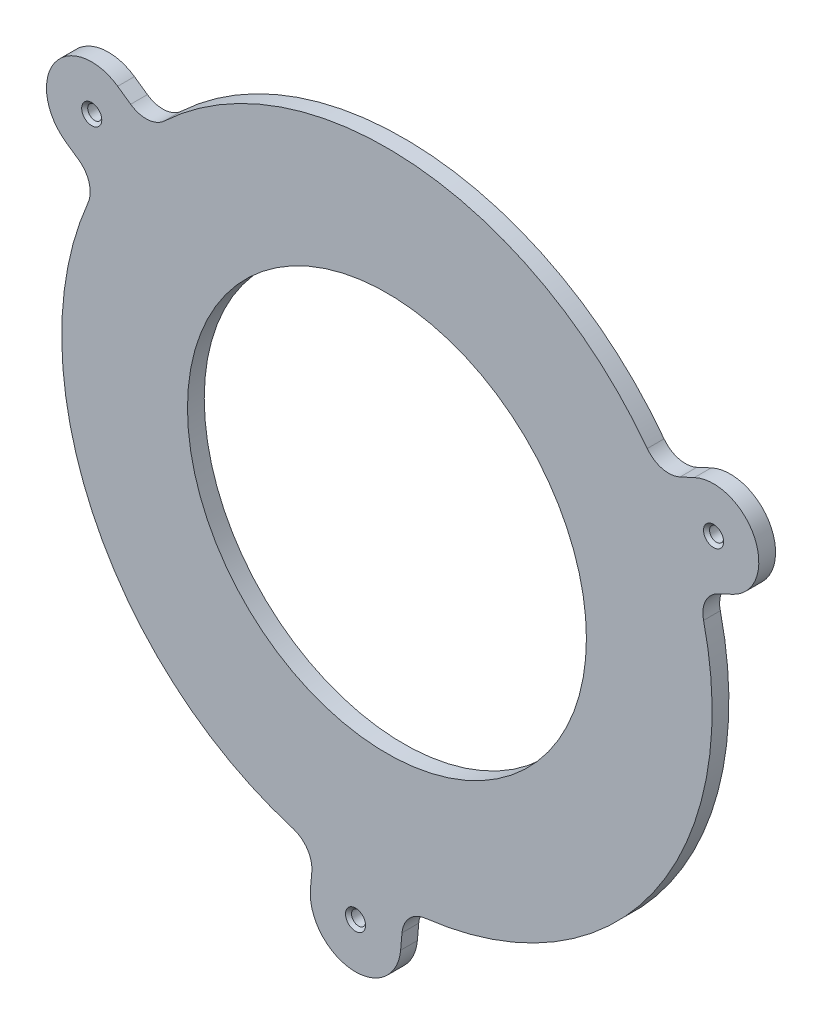
ISO-10303-21;
HEADER;
FILE_DESCRIPTION(('STEP AP214'),'2;1');
FILE_NAME('part.step','',(''),(''),'','','');
FILE_SCHEMA(('AUTOMOTIVE_DESIGN { 1 0 10303 214 1 1 1 1 }'));
ENDSEC;
DATA;
#1=APPLICATION_CONTEXT('core data for automotive mechanical design processes');
#2=APPLICATION_PROTOCOL_DEFINITION('international standard','automotive_design',2000,#1);
#3=PRODUCT_CONTEXT('',#1,'mechanical');
#4=PRODUCT('Part','Part','',(#3));
#5=PRODUCT_RELATED_PRODUCT_CATEGORY('part','',(#4));
#6=PRODUCT_DEFINITION_FORMATION('','',#4);
#7=PRODUCT_DEFINITION_CONTEXT('part definition',#1,'design');
#8=PRODUCT_DEFINITION('design','',#6,#7);
#9=PRODUCT_DEFINITION_SHAPE('','',#8);
#10=(LENGTH_UNIT() NAMED_UNIT(*) SI_UNIT(.MILLI.,.METRE.));
#11=(NAMED_UNIT(*) PLANE_ANGLE_UNIT() SI_UNIT($,.RADIAN.));
#12=(NAMED_UNIT(*) SI_UNIT($,.STERADIAN.) SOLID_ANGLE_UNIT());
#13=UNCERTAINTY_MEASURE_WITH_UNIT(LENGTH_MEASURE(1.E-05),#10,'distance_accuracy_value','');
#14=(GEOMETRIC_REPRESENTATION_CONTEXT(3) GLOBAL_UNCERTAINTY_ASSIGNED_CONTEXT((#13)) GLOBAL_UNIT_ASSIGNED_CONTEXT((#10,
#11,#12)) REPRESENTATION_CONTEXT('',''));
#15=CARTESIAN_POINT('',(0.,0.,0.));
#16=DIRECTION('',(0.,0.,1.));
#17=DIRECTION('',(1.,0.,0.));
#18=AXIS2_PLACEMENT_3D('',#15,#16,#17);
#19=CARTESIAN_POINT('',(0.,0.,5.));
#20=DIRECTION('',(0.,0.,-1.));
#21=DIRECTION('',(-1.,0.,0.));
#22=AXIS2_PLACEMENT_3D('',#19,#20,#21);
#23=CYLINDRICAL_SURFACE('',#22,97.);
#24=CARTESIAN_POINT('',(0.,0.,0.));
#25=DIRECTION('',(0.,0.,1.));
#26=DIRECTION('',(1.,0.,0.));
#27=AXIS2_PLACEMENT_3D('',#24,#25,#26);
#28=CIRCLE('',#27,97.);
#29=CARTESIAN_POINT('',(-89.1665031008976,38.1881490093146,0.));
#30=VERTEX_POINT('',#29);
#31=CARTESIAN_POINT('',(-28.0613040507495,-92.8523732328441,0.));
#32=VERTEX_POINT('',#31);
#33=EDGE_CURVE('E261',#30,#32,#28,.T.);
#34=ORIENTED_EDGE('',*,*,#33,.T.);
#35=DIRECTION('',(0.,0.,-1.));
#36=VECTOR('',#35,1.);
#37=CARTESIAN_POINT('',(-28.0613040507495,-92.8523732328441,5.));
#38=LINE('',#37,#36);
#39=CARTESIAN_POINT('',(-28.0613040507495,-92.8523732328441,5.));
#40=VERTEX_POINT('',#39);
#41=EDGE_CURVE('E307',#32,#40,#38,.F.);
#42=ORIENTED_EDGE('',*,*,#41,.T.);
#43=CARTESIAN_POINT('',(0.,0.,5.));
#44=DIRECTION('',(0.,0.,1.));
#45=DIRECTION('',(1.,0.,0.));
#46=AXIS2_PLACEMENT_3D('',#43,#44,#45);
#47=CIRCLE('',#46,97.);
#48=CARTESIAN_POINT('',(-89.1665031008976,38.1881490093146,5.));
#49=VERTEX_POINT('',#48);
#50=EDGE_CURVE('E256',#49,#40,#47,.T.);
#51=ORIENTED_EDGE('',*,*,#50,.F.);
#52=DIRECTION('',(0.,0.,-1.));
#53=VECTOR('',#52,1.);
#54=CARTESIAN_POINT('',(-89.1665031008976,38.1881490093146,5.));
#55=LINE('',#54,#53);
#56=EDGE_CURVE('E270',#49,#30,#55,.T.);
#57=ORIENTED_EDGE('',*,*,#56,.T.);
#58=EDGE_LOOP('',(#34,#42,#51,#57));
#59=FACE_BOUND('',#58,.T.);
#60=ADVANCED_FACE('F46',(#59),#23,.T.);
#61=CARTESIAN_POINT('',(11.5113443848759,-96.3145313566587,5.));
#62=VERTEX_POINT('',#61);
#63=CARTESIAN_POINT('',(94.4431660466919,22.1243844451543,5.));
#64=VERTEX_POINT('',#63);
#65=EDGE_CURVE('E259',#62,#64,#47,.T.);
#66=ORIENTED_EDGE('',*,*,#65,.F.);
#67=DIRECTION('',(0.,0.,-1.));
#68=VECTOR('',#67,1.);
#69=CARTESIAN_POINT('',(11.5113443848759,-96.3145313566587,5.));
#70=LINE('',#69,#68);
#71=CARTESIAN_POINT('',(11.5113443848759,-96.3145313566587,0.));
#72=VERTEX_POINT('',#71);
#73=EDGE_CURVE('E305',#62,#72,#70,.T.);
#74=ORIENTED_EDGE('',*,*,#73,.T.);
#75=CARTESIAN_POINT('',(94.4431660466919,22.1243844451543,0.));
#76=VERTEX_POINT('',#75);
#77=EDGE_CURVE('E264',#72,#76,#28,.T.);
#78=ORIENTED_EDGE('',*,*,#77,.T.);
#79=DIRECTION('',(0.,0.,-1.));
#80=VECTOR('',#79,1.);
#81=CARTESIAN_POINT('',(94.4431660466919,22.1243844451543,5.));
#82=LINE('',#81,#80);
#83=EDGE_CURVE('E288',#76,#64,#82,.F.);
#84=ORIENTED_EDGE('',*,*,#83,.T.);
#85=EDGE_LOOP('',(#66,#74,#78,#84));
#86=FACE_BOUND('',#85,.T.);
#87=ADVANCED_FACE('F331',(#86),#23,.T.);
#88=CARTESIAN_POINT('',(77.6551587160211,58.1263823473436,5.));
#89=VERTEX_POINT('',#88);
#90=CARTESIAN_POINT('',(-66.3818619959432,70.7279887876897,5.));
#91=VERTEX_POINT('',#90);
#92=EDGE_CURVE('E260',#89,#91,#47,.T.);
#93=ORIENTED_EDGE('',*,*,#92,.F.);
#94=DIRECTION('',(0.,0.,-1.));
#95=VECTOR('',#94,1.);
#96=CARTESIAN_POINT('',(77.6551587160211,58.1263823473436,5.));
#97=LINE('',#96,#95);
#98=CARTESIAN_POINT('',(77.6551587160211,58.1263823473436,0.));
#99=VERTEX_POINT('',#98);
#100=EDGE_CURVE('E286',#89,#99,#97,.T.);
#101=ORIENTED_EDGE('',*,*,#100,.T.);
#102=CARTESIAN_POINT('',(-66.3818619959432,70.7279887876897,0.));
#103=VERTEX_POINT('',#102);
#104=EDGE_CURVE('E253',#99,#103,#28,.T.);
#105=ORIENTED_EDGE('',*,*,#104,.T.);
#106=DIRECTION('',(0.,0.,-1.));
#107=VECTOR('',#106,1.);
#108=CARTESIAN_POINT('',(-66.3818619959432,70.7279887876897,5.));
#109=LINE('',#108,#107);
#110=EDGE_CURVE('E267',#103,#91,#109,.F.);
#111=ORIENTED_EDGE('',*,*,#110,.T.);
#112=EDGE_LOOP('',(#93,#101,#105,#111));
#113=FACE_BOUND('',#112,.T.);
#114=ADVANCED_FACE('F343',(#113),#23,.T.);
#115=CARTESIAN_POINT('',(0.,0.,5.));
#116=DIRECTION('',(0.,0.,1.));
#117=DIRECTION('',(1.,0.,0.));
#118=AXIS2_PLACEMENT_3D('',#115,#116,#117);
#119=PLANE('',#118);
#120=CARTESIAN_POINT('',(-9.36924234537438,-107.090930044863,5.));
#121=DIRECTION('',(0.,0.,1.));
#122=DIRECTION('',(1.,0.,0.));
#123=AXIS2_PLACEMENT_3D('',#120,#121,#122);
#124=CIRCLE('',#123,3.);
#125=CARTESIAN_POINT('',(-6.36924234537438,-107.090930044863,5.));
#126=VERTEX_POINT('',#125);
#127=EDGE_CURVE('E465',#126,#126,#124,.T.);
#128=ORIENTED_EDGE('',*,*,#127,.F.);
#129=EDGE_LOOP('',(#128));
#130=FACE_BOUND('',#129,.T.);
#131=CARTESIAN_POINT('',(97.4280871064402,45.4314631371246,5.));
#132=DIRECTION('',(0.,0.,1.));
#133=DIRECTION('',(1.,0.,0.));
#134=AXIS2_PLACEMENT_3D('',#131,#132,#133);
#135=CIRCLE('',#134,3.);
#136=CARTESIAN_POINT('',(100.42808710644,45.4314631371246,5.));
#137=VERTEX_POINT('',#136);
#138=EDGE_CURVE('E478',#137,#137,#135,.T.);
#139=ORIENTED_EDGE('',*,*,#138,.F.);
#140=EDGE_LOOP('',(#139));
#141=FACE_BOUND('',#140,.T.);
#142=CARTESIAN_POINT('',(-88.0588447610665,61.6594669077376,5.));
#143=DIRECTION('',(0.,0.,1.));
#144=DIRECTION('',(1.,0.,0.));
#145=AXIS2_PLACEMENT_3D('',#142,#143,#144);
#146=CIRCLE('',#145,3.);
#147=CARTESIAN_POINT('',(-85.0588447610665,61.6594669077376,5.));
#148=VERTEX_POINT('',#147);
#149=EDGE_CURVE('E221',#148,#148,#146,.T.);
#150=ORIENTED_EDGE('',*,*,#149,.F.);
#151=EDGE_LOOP('',(#150));
#152=FACE_BOUND('',#151,.T.);
#153=DIRECTION('',(0.819152044288991,-0.573576436351048,0.));
#154=VECTOR('',#153,1.);
#155=CARTESIAN_POINT('',(-7.74328189073919,-11.0585525979014,5.));
#156=LINE('',#155,#154);
#157=CARTESIAN_POINT('',(-95.8021266518057,50.6009143098362,5.));
#158=VERTEX_POINT('',#157);
#159=CARTESIAN_POINT('',(-91.9318300101633,47.8909034262505,5.));
#160=VERTEX_POINT('',#159);
#161=EDGE_CURVE('E242',#158,#160,#156,.T.);
#162=ORIENTED_EDGE('',*,*,#161,.T.);
#163=CARTESIAN_POINT('',(-96.5204415009716,41.3376870719385,5.));
#164=DIRECTION('',(0.,0.,1.));
#165=DIRECTION('',(1.,0.,0.));
#166=AXIS2_PLACEMENT_3D('',#163,#164,#165);
#167=CIRCLE('',#166,8.);
#168=EDGE_CURVE('E274',#160,#49,#167,.F.);
#169=ORIENTED_EDGE('',*,*,#168,.T.);
#170=ORIENTED_EDGE('',*,*,#50,.T.);
#171=CARTESIAN_POINT('',(-30.3756384054505,-100.510300922151,5.));
#172=DIRECTION('',(0.,0.,1.));
#173=DIRECTION('',(1.,0.,0.));
#174=AXIS2_PLACEMENT_3D('',#171,#172,#173);
#175=CIRCLE('',#174,8.);
#176=CARTESIAN_POINT('',(-22.4060808207165,-101.207546864132,5.));
#177=VERTEX_POINT('',#176);
#178=EDGE_CURVE('E54',#40,#177,#175,.F.);
#179=ORIENTED_EDGE('',*,*,#178,.T.);
#180=DIRECTION('',(0.0871557427476689,0.996194698091745,0.));
#181=VECTOR('',#180,1.);
#182=CARTESIAN_POINT('',(-13.4486284242385,1.17660252709353,5.));
#183=LINE('',#182,#181);
#184=CARTESIAN_POINT('',(-22.8178707696129,-105.914327517769,5.));
#185=VERTEX_POINT('',#184);
#186=EDGE_CURVE('E170',#185,#177,#183,.T.);
#187=ORIENTED_EDGE('',*,*,#186,.F.);
#188=CARTESIAN_POINT('',(-9.36924234537438,-107.090930044863,5.));
#189=DIRECTION('',(0.,0.,1.));
#190=DIRECTION('',(-0.499999999999992,0.866025403784443,0.));
#191=AXIS2_PLACEMENT_3D('',#188,#189,#190);
#192=CIRCLE('',#191,13.5);
#193=CARTESIAN_POINT('',(4.07938607886418,-108.267532571956,5.));
#194=VERTEX_POINT('',#193);
#195=EDGE_CURVE('E184',#185,#194,#192,.T.);
#196=ORIENTED_EDGE('',*,*,#195,.T.);
#197=DIRECTION('',(0.0871557427476694,0.996194698091745,0.));
#198=VECTOR('',#197,1.);
#199=CARTESIAN_POINT('',(13.4486284242386,-1.17660252709354,5.));
#200=LINE('',#199,#198);
#201=CARTESIAN_POINT('',(4.49117602776059,-103.560751918319,5.));
#202=VERTEX_POINT('',#201);
#203=EDGE_CURVE('E177',#194,#202,#200,.T.);
#204=ORIENTED_EDGE('',*,*,#203,.T.);
#205=CARTESIAN_POINT('',(12.4607336124945,-104.257997860301,5.));
#206=DIRECTION('',(0.,0.,1.));
#207=DIRECTION('',(1.,0.,0.));
#208=AXIS2_PLACEMENT_3D('',#205,#206,#207);
#209=CIRCLE('',#208,8.);
#210=EDGE_CURVE('E311',#202,#62,#209,.F.);
#211=ORIENTED_EDGE('',*,*,#210,.T.);
#212=ORIENTED_EDGE('',*,*,#65,.T.);
#213=CARTESIAN_POINT('',(102.232293143326,23.9490759457856,5.));
#214=DIRECTION('',(0.,0.,1.));
#215=DIRECTION('',(1.,0.,0.));
#216=AXIS2_PLACEMENT_3D('',#213,#214,#215);
#217=CIRCLE('',#216,8.);
#218=CARTESIAN_POINT('',(98.8513470494008,31.1995382420788,5.));
#219=VERTEX_POINT('',#218);
#220=EDGE_CURVE('E297',#64,#219,#217,.F.);
#221=ORIENTED_EDGE('',*,*,#220,.T.);
#222=DIRECTION('',(-0.906307787036653,-0.422618261740694,0.));
#223=VECTOR('',#222,1.);
#224=CARTESIAN_POINT('',(5.70534653349936,-12.2351551249948,5.));
#225=LINE('',#224,#223);
#226=CARTESIAN_POINT('',(103.13343363994,33.1963080121298,5.));
#227=VERTEX_POINT('',#226);
#228=EDGE_CURVE('E198',#227,#219,#225,.T.);
#229=ORIENTED_EDGE('',*,*,#228,.F.);
#230=CARTESIAN_POINT('',(97.4280871064402,45.4314631371246,5.));
#231=DIRECTION('',(0.,0.,1.));
#232=DIRECTION('',(-0.500000000000004,-0.866025403784436,0.));
#233=AXIS2_PLACEMENT_3D('',#230,#231,#232);
#234=CIRCLE('',#233,13.5);
#235=CARTESIAN_POINT('',(91.7227405729408,57.6666182621195,5.));
#236=VERTEX_POINT('',#235);
#237=EDGE_CURVE('E207',#227,#236,#234,.T.);
#238=ORIENTED_EDGE('',*,*,#237,.T.);
#239=DIRECTION('',(-0.906307787036653,-0.422618261740694,0.));
#240=VECTOR('',#239,1.);
#241=CARTESIAN_POINT('',(-5.7053465334994,12.2351551249949,5.));
#242=LINE('',#241,#240);
#243=CARTESIAN_POINT('',(87.4406539824021,55.6698484920684,5.));
#244=VERTEX_POINT('',#243);
#245=EDGE_CURVE('E210',#236,#244,#242,.T.);
#246=ORIENTED_EDGE('',*,*,#245,.T.);
#247=CARTESIAN_POINT('',(84.0597078884764,62.9203107883616,5.));
#248=DIRECTION('',(0.,0.,1.));
#249=DIRECTION('',(1.,0.,0.));
#250=AXIS2_PLACEMENT_3D('',#247,#248,#249);
#251=CIRCLE('',#250,8.);
#252=EDGE_CURVE('E293',#244,#89,#251,.F.);
#253=ORIENTED_EDGE('',*,*,#252,.T.);
#254=ORIENTED_EDGE('',*,*,#92,.T.);
#255=CARTESIAN_POINT('',(-71.8566547378766,76.5612249763651,5.));
#256=DIRECTION('',(0.,0.,1.));
#257=DIRECTION('',(1.,0.,0.));
#258=AXIS2_PLACEMENT_3D('',#255,#256,#257);
#259=CIRCLE('',#258,8.);
#260=CARTESIAN_POINT('',(-76.445266228685,70.0080086220532,5.));
#261=VERTEX_POINT('',#260);
#262=EDGE_CURVE('E278',#91,#261,#259,.F.);
#263=ORIENTED_EDGE('',*,*,#262,.T.);
#264=DIRECTION('',(0.819152044288991,-0.573576436351047,0.));
#265=VECTOR('',#264,1.);
#266=CARTESIAN_POINT('',(7.74328189073913,11.0585525979014,5.));
#267=LINE('',#266,#265);
#268=CARTESIAN_POINT('',(-80.3155628703274,72.7180195056389,5.));
#269=VERTEX_POINT('',#268);
#270=EDGE_CURVE('E230',#269,#261,#267,.T.);
#271=ORIENTED_EDGE('',*,*,#270,.F.);
#272=CARTESIAN_POINT('',(-88.0588447610665,61.6594669077376,5.));
#273=DIRECTION('',(0.,0.,1.));
#274=DIRECTION('',(1.,0.,0.));
#275=AXIS2_PLACEMENT_3D('',#272,#273,#274);
#276=CIRCLE('',#275,13.5);
#277=EDGE_CURVE('E239',#269,#158,#276,.T.);
#278=ORIENTED_EDGE('',*,*,#277,.T.);
#279=EDGE_LOOP('',(#162,#169,#170,#179,#187,#196,#204,#211,#212,#221,#229,#238,#246,#253,#254,
#263,#271,#278));
#280=FACE_BOUND('',#279,.T.);
#281=CARTESIAN_POINT('',(0.,0.,5.));
#282=DIRECTION('',(0.,0.,1.));
#283=DIRECTION('',(1.,0.,0.));
#284=AXIS2_PLACEMENT_3D('',#281,#282,#283);
#285=CIRCLE('',#284,59.5);
#286=CARTESIAN_POINT('',(59.5,0.,5.));
#287=VERTEX_POINT('',#286);
#288=EDGE_CURVE('E250',#287,#287,#285,.T.);
#289=ORIENTED_EDGE('',*,*,#288,.F.);
#290=EDGE_LOOP('',(#289));
#291=FACE_BOUND('',#290,.T.);
#292=ADVANCED_FACE('F181',(#130,#141,#152,#280,#291),#119,.T.);
#293=CARTESIAN_POINT('',(0.,0.,0.));
#294=DIRECTION('',(0.,0.,1.));
#295=DIRECTION('',(1.,0.,0.));
#296=AXIS2_PLACEMENT_3D('',#293,#294,#295);
#297=PLANE('',#296);
#298=CARTESIAN_POINT('',(-9.36924234537438,-107.090930044863,0.));
#299=DIRECTION('',(0.,0.,1.));
#300=DIRECTION('',(1.,0.,0.));
#301=AXIS2_PLACEMENT_3D('',#298,#299,#300);
#302=CIRCLE('',#301,3.);
#303=CARTESIAN_POINT('',(-6.36924234537438,-107.090930044863,0.));
#304=VERTEX_POINT('',#303);
#305=EDGE_CURVE('E466',#304,#304,#302,.T.);
#306=ORIENTED_EDGE('',*,*,#305,.T.);
#307=EDGE_LOOP('',(#306));
#308=FACE_BOUND('',#307,.T.);
#309=CARTESIAN_POINT('',(97.4280871064402,45.4314631371246,0.));
#310=DIRECTION('',(0.,0.,1.));
#311=DIRECTION('',(1.,0.,0.));
#312=AXIS2_PLACEMENT_3D('',#309,#310,#311);
#313=CIRCLE('',#312,3.);
#314=CARTESIAN_POINT('',(100.42808710644,45.4314631371246,0.));
#315=VERTEX_POINT('',#314);
#316=EDGE_CURVE('E475',#315,#315,#313,.T.);
#317=ORIENTED_EDGE('',*,*,#316,.T.);
#318=EDGE_LOOP('',(#317));
#319=FACE_BOUND('',#318,.T.);
#320=CARTESIAN_POINT('',(-88.0588447610665,61.6594669077376,0.));
#321=DIRECTION('',(0.,0.,1.));
#322=DIRECTION('',(1.,0.,0.));
#323=AXIS2_PLACEMENT_3D('',#320,#321,#322);
#324=CIRCLE('',#323,3.);
#325=CARTESIAN_POINT('',(-85.0588447610665,61.6594669077376,0.));
#326=VERTEX_POINT('',#325);
#327=EDGE_CURVE('E218',#326,#326,#324,.T.);
#328=ORIENTED_EDGE('',*,*,#327,.T.);
#329=EDGE_LOOP('',(#328));
#330=FACE_BOUND('',#329,.T.);
#331=ORIENTED_EDGE('',*,*,#33,.F.);
#332=CARTESIAN_POINT('',(-96.5204415009716,41.3376870719385,0.));
#333=DIRECTION('',(0.,0.,1.));
#334=DIRECTION('',(1.,0.,0.));
#335=AXIS2_PLACEMENT_3D('',#332,#333,#334);
#336=CIRCLE('',#335,8.);
#337=CARTESIAN_POINT('',(-91.9318300101633,47.8909034262504,0.));
#338=VERTEX_POINT('',#337);
#339=EDGE_CURVE('E276',#30,#338,#336,.T.);
#340=ORIENTED_EDGE('',*,*,#339,.T.);
#341=DIRECTION('',(-0.819152044288991,0.573576436351048,0.));
#342=VECTOR('',#341,1.);
#343=CARTESIAN_POINT('',(-7.74328189073919,-11.0585525979014,0.));
#344=LINE('',#343,#342);
#345=CARTESIAN_POINT('',(-95.8021266518057,50.6009143098362,0.));
#346=VERTEX_POINT('',#345);
#347=EDGE_CURVE('E231',#338,#346,#344,.T.);
#348=ORIENTED_EDGE('',*,*,#347,.T.);
#349=CARTESIAN_POINT('',(-88.0588447610665,61.6594669077376,0.));
#350=DIRECTION('',(0.,0.,1.));
#351=DIRECTION('',(1.,0.,0.));
#352=AXIS2_PLACEMENT_3D('',#349,#350,#351);
#353=CIRCLE('',#352,13.5);
#354=CARTESIAN_POINT('',(-80.3155628703274,72.7180195056389,0.));
#355=VERTEX_POINT('',#354);
#356=EDGE_CURVE('E236',#346,#355,#353,.F.);
#357=ORIENTED_EDGE('',*,*,#356,.T.);
#358=DIRECTION('',(-0.819152044288991,0.573576436351047,0.));
#359=VECTOR('',#358,1.);
#360=CARTESIAN_POINT('',(7.74328189073913,11.0585525979014,0.));
#361=LINE('',#360,#359);
#362=CARTESIAN_POINT('',(-76.445266228685,70.0080086220532,0.));
#363=VERTEX_POINT('',#362);
#364=EDGE_CURVE('E233',#363,#355,#361,.T.);
#365=ORIENTED_EDGE('',*,*,#364,.F.);
#366=CARTESIAN_POINT('',(-71.8566547378766,76.5612249763651,0.));
#367=DIRECTION('',(0.,0.,1.));
#368=DIRECTION('',(1.,0.,0.));
#369=AXIS2_PLACEMENT_3D('',#366,#367,#368);
#370=CIRCLE('',#369,8.);
#371=EDGE_CURVE('E280',#363,#103,#370,.T.);
#372=ORIENTED_EDGE('',*,*,#371,.T.);
#373=ORIENTED_EDGE('',*,*,#104,.F.);
#374=CARTESIAN_POINT('',(84.0597078884764,62.9203107883616,0.));
#375=DIRECTION('',(0.,0.,1.));
#376=DIRECTION('',(1.,0.,0.));
#377=AXIS2_PLACEMENT_3D('',#374,#375,#376);
#378=CIRCLE('',#377,8.);
#379=CARTESIAN_POINT('',(87.440653982402,55.6698484920684,0.));
#380=VERTEX_POINT('',#379);
#381=EDGE_CURVE('E295',#99,#380,#378,.T.);
#382=ORIENTED_EDGE('',*,*,#381,.T.);
#383=DIRECTION('',(0.906307787036653,0.422618261740694,0.));
#384=VECTOR('',#383,1.);
#385=CARTESIAN_POINT('',(-5.7053465334994,12.2351551249949,0.));
#386=LINE('',#385,#384);
#387=CARTESIAN_POINT('',(91.7227405729408,57.6666182621195,0.));
#388=VERTEX_POINT('',#387);
#389=EDGE_CURVE('E199',#380,#388,#386,.T.);
#390=ORIENTED_EDGE('',*,*,#389,.T.);
#391=CARTESIAN_POINT('',(97.4280871064402,45.4314631371246,0.));
#392=DIRECTION('',(0.,0.,1.));
#393=DIRECTION('',(1.,0.,0.));
#394=AXIS2_PLACEMENT_3D('',#391,#392,#393);
#395=CIRCLE('',#394,13.5);
#396=CARTESIAN_POINT('',(103.13343363994,33.1963080121298,0.));
#397=VERTEX_POINT('',#396);
#398=EDGE_CURVE('E204',#388,#397,#395,.F.);
#399=ORIENTED_EDGE('',*,*,#398,.T.);
#400=DIRECTION('',(0.906307787036652,0.422618261740694,0.));
#401=VECTOR('',#400,1.);
#402=CARTESIAN_POINT('',(5.70534653349936,-12.2351551249948,0.));
#403=LINE('',#402,#401);
#404=CARTESIAN_POINT('',(98.8513470494007,31.1995382420788,0.));
#405=VERTEX_POINT('',#404);
#406=EDGE_CURVE('E201',#405,#397,#403,.T.);
#407=ORIENTED_EDGE('',*,*,#406,.F.);
#408=CARTESIAN_POINT('',(102.232293143326,23.9490759457856,0.));
#409=DIRECTION('',(0.,0.,1.));
#410=DIRECTION('',(1.,0.,0.));
#411=AXIS2_PLACEMENT_3D('',#408,#409,#410);
#412=CIRCLE('',#411,8.);
#413=EDGE_CURVE('E299',#405,#76,#412,.T.);
#414=ORIENTED_EDGE('',*,*,#413,.T.);
#415=ORIENTED_EDGE('',*,*,#77,.F.);
#416=CARTESIAN_POINT('',(12.4607336124945,-104.257997860301,0.));
#417=DIRECTION('',(0.,0.,1.));
#418=DIRECTION('',(1.,0.,0.));
#419=AXIS2_PLACEMENT_3D('',#416,#417,#418);
#420=CIRCLE('',#419,8.);
#421=CARTESIAN_POINT('',(4.49117602776059,-103.560751918319,0.));
#422=VERTEX_POINT('',#421);
#423=EDGE_CURVE('E313',#72,#422,#420,.T.);
#424=ORIENTED_EDGE('',*,*,#423,.T.);
#425=DIRECTION('',(-0.0871557427476694,-0.996194698091745,0.));
#426=VECTOR('',#425,1.);
#427=CARTESIAN_POINT('',(13.4486284242386,-1.17660252709354,0.));
#428=LINE('',#427,#426);
#429=CARTESIAN_POINT('',(4.07938607886418,-108.267532571956,0.));
#430=VERTEX_POINT('',#429);
#431=EDGE_CURVE('E194',#422,#430,#428,.T.);
#432=ORIENTED_EDGE('',*,*,#431,.T.);
#433=CARTESIAN_POINT('',(-9.36924234537438,-107.090930044863,0.));
#434=DIRECTION('',(0.,0.,1.));
#435=DIRECTION('',(1.,0.,0.));
#436=AXIS2_PLACEMENT_3D('',#433,#434,#435);
#437=CIRCLE('',#436,13.5);
#438=CARTESIAN_POINT('',(-22.8178707696129,-105.914327517769,0.));
#439=VERTEX_POINT('',#438);
#440=EDGE_CURVE('E196',#430,#439,#437,.F.);
#441=ORIENTED_EDGE('',*,*,#440,.T.);
#442=DIRECTION('',(-0.0871557427476688,-0.996194698091745,0.));
#443=VECTOR('',#442,1.);
#444=CARTESIAN_POINT('',(-13.4486284242385,1.17660252709353,0.));
#445=LINE('',#444,#443);
#446=CARTESIAN_POINT('',(-22.4060808207165,-101.207546864132,0.));
#447=VERTEX_POINT('',#446);
#448=EDGE_CURVE('E171',#447,#439,#445,.T.);
#449=ORIENTED_EDGE('',*,*,#448,.F.);
#450=CARTESIAN_POINT('',(-30.3756384054505,-100.510300922151,0.));
#451=DIRECTION('',(0.,0.,1.));
#452=DIRECTION('',(1.,0.,0.));
#453=AXIS2_PLACEMENT_3D('',#450,#451,#452);
#454=CIRCLE('',#453,8.);
#455=EDGE_CURVE('E11',#447,#32,#454,.T.);
#456=ORIENTED_EDGE('',*,*,#455,.T.);
#457=EDGE_LOOP('',(#331,#340,#348,#357,#365,#372,#373,#382,#390,#399,#407,#414,#415,#424,#432,
#441,#449,#456));
#458=FACE_BOUND('',#457,.T.);
#459=CARTESIAN_POINT('',(0.,0.,0.));
#460=DIRECTION('',(0.,0.,1.));
#461=DIRECTION('',(1.,0.,0.));
#462=AXIS2_PLACEMENT_3D('',#459,#460,#461);
#463=CIRCLE('',#462,59.5);
#464=CARTESIAN_POINT('',(59.5,0.,0.));
#465=VERTEX_POINT('',#464);
#466=EDGE_CURVE('E249',#465,#465,#463,.T.);
#467=ORIENTED_EDGE('',*,*,#466,.T.);
#468=EDGE_LOOP('',(#467));
#469=FACE_BOUND('',#468,.T.);
#470=ADVANCED_FACE('F319',(#308,#319,#330,#458,#469),#297,.F.);
#471=CARTESIAN_POINT('',(0.,0.,5.));
#472=DIRECTION('',(0.,0.,-1.));
#473=DIRECTION('',(-1.,0.,0.));
#474=AXIS2_PLACEMENT_3D('',#471,#472,#473);
#475=CYLINDRICAL_SURFACE('',#474,59.5);
#476=ORIENTED_EDGE('',*,*,#288,.T.);
#477=EDGE_LOOP('',(#476));
#478=FACE_BOUND('',#477,.T.);
#479=ORIENTED_EDGE('',*,*,#466,.F.);
#480=EDGE_LOOP('',(#479));
#481=FACE_BOUND('',#480,.T.);
#482=ADVANCED_FACE('F395',(#478,#481),#475,.F.);
#483=CARTESIAN_POINT('',(7.74328189073913,11.0585525979014,-43.6584137823149));
#484=DIRECTION('',(-0.573576436351047,-0.819152044288991,0.));
#485=DIRECTION('',(0.819152044288991,-0.573576436351047,0.));
#486=AXIS2_PLACEMENT_3D('',#483,#484,#485);
#487=PLANE('',#486);
#488=ORIENTED_EDGE('',*,*,#270,.T.);
#489=DIRECTION('',(0.,0.,1.));
#490=VECTOR('',#489,1.);
#491=CARTESIAN_POINT('',(-76.445266228685,70.0080086220532,0.));
#492=LINE('',#491,#490);
#493=EDGE_CURVE('E272',#261,#363,#492,.F.);
#494=ORIENTED_EDGE('',*,*,#493,.T.);
#495=ORIENTED_EDGE('',*,*,#364,.T.);
#496=DIRECTION('',(0.,0.,1.));
#497=VECTOR('',#496,1.);
#498=CARTESIAN_POINT('',(-80.3155628703274,72.7180195056389,-43.6584137823149));
#499=LINE('',#498,#497);
#500=EDGE_CURVE('E244',#355,#269,#499,.T.);
#501=ORIENTED_EDGE('',*,*,#500,.T.);
#502=EDGE_LOOP('',(#488,#494,#495,#501));
#503=FACE_BOUND('',#502,.T.);
#504=ADVANCED_FACE('F350',(#503),#487,.F.);
#505=CARTESIAN_POINT('',(-7.74328189073919,-11.0585525979014,-43.6584137823149));
#506=DIRECTION('',(-0.573576436351048,-0.819152044288991,0.));
#507=DIRECTION('',(0.819152044288991,-0.573576436351048,0.));
#508=AXIS2_PLACEMENT_3D('',#505,#506,#507);
#509=PLANE('',#508);
#510=ORIENTED_EDGE('',*,*,#347,.F.);
#511=DIRECTION('',(0.,0.,-1.));
#512=VECTOR('',#511,1.);
#513=CARTESIAN_POINT('',(-91.9318300101633,47.8909034262504,-43.6584137823149));
#514=LINE('',#513,#512);
#515=EDGE_CURVE('E258',#338,#160,#514,.F.);
#516=ORIENTED_EDGE('',*,*,#515,.T.);
#517=ORIENTED_EDGE('',*,*,#161,.F.);
#518=DIRECTION('',(0.,0.,1.));
#519=VECTOR('',#518,1.);
#520=CARTESIAN_POINT('',(-95.8021266518057,50.6009143098362,-43.6584137823149));
#521=LINE('',#520,#519);
#522=EDGE_CURVE('E234',#346,#158,#521,.T.);
#523=ORIENTED_EDGE('',*,*,#522,.F.);
#524=EDGE_LOOP('',(#510,#516,#517,#523));
#525=FACE_BOUND('',#524,.T.);
#526=ADVANCED_FACE('F358',(#525),#509,.T.);
#527=CARTESIAN_POINT('',(-88.0588447610665,61.6594669077376,-43.6584137823149));
#528=DIRECTION('',(0.,0.,1.));
#529=DIRECTION('',(1.,0.,0.));
#530=AXIS2_PLACEMENT_3D('',#527,#528,#529);
#531=CYLINDRICAL_SURFACE('',#530,13.5);
#532=ORIENTED_EDGE('',*,*,#356,.F.);
#533=ORIENTED_EDGE('',*,*,#522,.T.);
#534=ORIENTED_EDGE('',*,*,#277,.F.);
#535=ORIENTED_EDGE('',*,*,#500,.F.);
#536=EDGE_LOOP('',(#532,#533,#534,#535));
#537=FACE_BOUND('',#536,.T.);
#538=ADVANCED_FACE('F353',(#537),#531,.T.);
#539=CARTESIAN_POINT('',(-96.5204415009716,41.3376870719385,5.));
#540=DIRECTION('',(0.,0.,-1.));
#541=DIRECTION('',(-1.,0.,0.));
#542=AXIS2_PLACEMENT_3D('',#539,#540,#541);
#543=CYLINDRICAL_SURFACE('',#542,8.);
#544=ORIENTED_EDGE('',*,*,#339,.F.);
#545=ORIENTED_EDGE('',*,*,#56,.F.);
#546=ORIENTED_EDGE('',*,*,#168,.F.);
#547=ORIENTED_EDGE('',*,*,#515,.F.);
#548=EDGE_LOOP('',(#544,#545,#546,#547));
#549=FACE_BOUND('',#548,.T.);
#550=ADVANCED_FACE('F366',(#549),#543,.F.);
#551=CARTESIAN_POINT('',(-71.8566547378766,76.5612249763651,5.));
#552=DIRECTION('',(0.,0.,-1.));
#553=DIRECTION('',(-1.,0.,0.));
#554=AXIS2_PLACEMENT_3D('',#551,#552,#553);
#555=CYLINDRICAL_SURFACE('',#554,8.);
#556=ORIENTED_EDGE('',*,*,#371,.F.);
#557=ORIENTED_EDGE('',*,*,#493,.F.);
#558=ORIENTED_EDGE('',*,*,#262,.F.);
#559=ORIENTED_EDGE('',*,*,#110,.F.);
#560=EDGE_LOOP('',(#556,#557,#558,#559));
#561=FACE_BOUND('',#560,.T.);
#562=ADVANCED_FACE('F342',(#561),#555,.F.);
#563=CARTESIAN_POINT('',(-88.0588447610665,61.6594669077376,0.900000000000001));
#564=DIRECTION('',(0.,0.,-1.));
#565=DIRECTION('',(-1.,0.,0.));
#566=AXIS2_PLACEMENT_3D('',#563,#564,#565);
#567=CONICAL_SURFACE('',#566,2.1,0.785398163397446);
#568=ORIENTED_EDGE('',*,*,#327,.F.);
#569=EDGE_LOOP('',(#568));
#570=FACE_BOUND('',#569,.T.);
#571=CARTESIAN_POINT('',(-88.0588447610665,61.6594669077376,0.900000000000001));
#572=DIRECTION('',(0.,0.,1.));
#573=DIRECTION('',(1.,0.,0.));
#574=AXIS2_PLACEMENT_3D('',#571,#572,#573);
#575=CIRCLE('',#574,2.1);
#576=CARTESIAN_POINT('',(-85.9588447610665,61.6594669077376,0.900000000000001));
#577=VERTEX_POINT('',#576);
#578=EDGE_CURVE('E227',#577,#577,#575,.T.);
#579=ORIENTED_EDGE('',*,*,#578,.T.);
#580=EDGE_LOOP('',(#579));
#581=FACE_BOUND('',#580,.T.);
#582=ADVANCED_FACE('F409',(#570,#581),#567,.F.);
#583=CARTESIAN_POINT('',(-88.0588447610665,61.6594669077376,5.));
#584=DIRECTION('',(0.,0.,1.));
#585=DIRECTION('',(1.,0.,0.));
#586=AXIS2_PLACEMENT_3D('',#583,#584,#585);
#587=CYLINDRICAL_SURFACE('',#586,2.1);
#588=ORIENTED_EDGE('',*,*,#578,.F.);
#589=EDGE_LOOP('',(#588));
#590=FACE_BOUND('',#589,.T.);
#591=CARTESIAN_POINT('',(-88.0588447610665,61.6594669077376,4.1));
#592=DIRECTION('',(0.,0.,1.));
#593=DIRECTION('',(1.,0.,0.));
#594=AXIS2_PLACEMENT_3D('',#591,#592,#593);
#595=CIRCLE('',#594,2.1);
#596=CARTESIAN_POINT('',(-85.9588447610665,61.6594669077376,4.1));
#597=VERTEX_POINT('',#596);
#598=EDGE_CURVE('E224',#597,#597,#595,.T.);
#599=ORIENTED_EDGE('',*,*,#598,.T.);
#600=EDGE_LOOP('',(#599));
#601=FACE_BOUND('',#600,.T.);
#602=ADVANCED_FACE('F412',(#590,#601),#587,.F.);
#603=CARTESIAN_POINT('',(-88.0588447610665,61.6594669077376,5.));
#604=DIRECTION('',(0.,0.,1.));
#605=DIRECTION('',(1.,0.,0.));
#606=AXIS2_PLACEMENT_3D('',#603,#604,#605);
#607=CONICAL_SURFACE('',#606,3.,0.785398163397447);
#608=ORIENTED_EDGE('',*,*,#598,.F.);
#609=EDGE_LOOP('',(#608));
#610=FACE_BOUND('',#609,.T.);
#611=ORIENTED_EDGE('',*,*,#149,.T.);
#612=EDGE_LOOP('',(#611));
#613=FACE_BOUND('',#612,.T.);
#614=ADVANCED_FACE('F416',(#610,#613),#607,.F.);
#615=CARTESIAN_POINT('',(5.70534653349936,-12.2351551249948,-42.5374134996216));
#616=DIRECTION('',(-0.422618261740694,0.906307787036652,0.));
#617=DIRECTION('',(-0.906307787036652,-0.422618261740694,0.));
#618=AXIS2_PLACEMENT_3D('',#615,#616,#617);
#619=PLANE('',#618);
#620=ORIENTED_EDGE('',*,*,#228,.T.);
#621=DIRECTION('',(0.,0.,1.));
#622=VECTOR('',#621,1.);
#623=CARTESIAN_POINT('',(98.8513470494007,31.1995382420788,0.));
#624=LINE('',#623,#622);
#625=EDGE_CURVE('E291',#219,#405,#624,.F.);
#626=ORIENTED_EDGE('',*,*,#625,.T.);
#627=ORIENTED_EDGE('',*,*,#406,.T.);
#628=DIRECTION('',(0.,0.,1.));
#629=VECTOR('',#628,1.);
#630=CARTESIAN_POINT('',(103.13343363994,33.1963080121298,-42.5374134996216));
#631=LINE('',#630,#629);
#632=EDGE_CURVE('E213',#397,#227,#631,.T.);
#633=ORIENTED_EDGE('',*,*,#632,.T.);
#634=EDGE_LOOP('',(#620,#626,#627,#633));
#635=FACE_BOUND('',#634,.T.);
#636=ADVANCED_FACE('F420',(#635),#619,.F.);
#637=CARTESIAN_POINT('',(-5.7053465334994,12.2351551249949,-42.5374134996216));
#638=DIRECTION('',(-0.422618261740693,0.906307787036653,0.));
#639=DIRECTION('',(-0.906307787036653,-0.422618261740694,0.));
#640=AXIS2_PLACEMENT_3D('',#637,#638,#639);
#641=PLANE('',#640);
#642=ORIENTED_EDGE('',*,*,#389,.F.);
#643=DIRECTION('',(0.,0.,-1.));
#644=VECTOR('',#643,1.);
#645=CARTESIAN_POINT('',(87.440653982402,55.6698484920684,-42.5374134996216));
#646=LINE('',#645,#644);
#647=EDGE_CURVE('E283',#380,#244,#646,.F.);
#648=ORIENTED_EDGE('',*,*,#647,.T.);
#649=ORIENTED_EDGE('',*,*,#245,.F.);
#650=DIRECTION('',(0.,0.,1.));
#651=VECTOR('',#650,1.);
#652=CARTESIAN_POINT('',(91.7227405729408,57.6666182621195,-42.5374134996216));
#653=LINE('',#652,#651);
#654=EDGE_CURVE('E202',#388,#236,#653,.T.);
#655=ORIENTED_EDGE('',*,*,#654,.F.);
#656=EDGE_LOOP('',(#642,#648,#649,#655));
#657=FACE_BOUND('',#656,.T.);
#658=ADVANCED_FACE('F424',(#657),#641,.T.);
#659=CARTESIAN_POINT('',(97.4280871064402,45.4314631371246,-42.5374134996216));
#660=DIRECTION('',(0.,0.,1.));
#661=DIRECTION('',(1.,0.,0.));
#662=AXIS2_PLACEMENT_3D('',#659,#660,#661);
#663=CYLINDRICAL_SURFACE('',#662,13.5);
#664=ORIENTED_EDGE('',*,*,#398,.F.);
#665=ORIENTED_EDGE('',*,*,#654,.T.);
#666=ORIENTED_EDGE('',*,*,#237,.F.);
#667=ORIENTED_EDGE('',*,*,#632,.F.);
#668=EDGE_LOOP('',(#664,#665,#666,#667));
#669=FACE_BOUND('',#668,.T.);
#670=ADVANCED_FACE('F426',(#669),#663,.T.);
#671=CARTESIAN_POINT('',(-13.4486284242385,1.17660252709353,-38.2229692731605));
#672=DIRECTION('',(0.996194698091744,-0.0871557427476688,0.));
#673=DIRECTION('',(0.0871557427476688,0.996194698091745,0.));
#674=AXIS2_PLACEMENT_3D('',#671,#672,#673);
#675=PLANE('',#674);
#676=ORIENTED_EDGE('',*,*,#186,.T.);
#677=DIRECTION('',(0.,0.,1.));
#678=VECTOR('',#677,1.);
#679=CARTESIAN_POINT('',(-22.4060808207165,-101.207546864132,0.));
#680=LINE('',#679,#678);
#681=EDGE_CURVE('E67',#177,#447,#680,.F.);
#682=ORIENTED_EDGE('',*,*,#681,.T.);
#683=ORIENTED_EDGE('',*,*,#448,.T.);
#684=DIRECTION('',(0.,0.,1.));
#685=VECTOR('',#684,1.);
#686=CARTESIAN_POINT('',(-22.8178707696129,-105.914327517769,-38.2229692731605));
#687=LINE('',#686,#685);
#688=EDGE_CURVE('E168',#439,#185,#687,.T.);
#689=ORIENTED_EDGE('',*,*,#688,.T.);
#690=EDGE_LOOP('',(#676,#682,#683,#689));
#691=FACE_BOUND('',#690,.T.);
#692=ADVANCED_FACE('F169',(#691),#675,.F.);
#693=CARTESIAN_POINT('',(13.4486284242386,-1.17660252709354,-38.2229692731605));
#694=DIRECTION('',(0.996194698091744,-0.0871557427476694,0.));
#695=DIRECTION('',(0.0871557427476694,0.996194698091745,0.));
#696=AXIS2_PLACEMENT_3D('',#693,#694,#695);
#697=PLANE('',#696);
#698=ORIENTED_EDGE('',*,*,#431,.F.);
#699=DIRECTION('',(0.,0.,-1.));
#700=VECTOR('',#699,1.);
#701=CARTESIAN_POINT('',(4.49117602776059,-103.560751918319,-38.2229692731605));
#702=LINE('',#701,#700);
#703=EDGE_CURVE('E302',#422,#202,#702,.F.);
#704=ORIENTED_EDGE('',*,*,#703,.T.);
#705=ORIENTED_EDGE('',*,*,#203,.F.);
#706=DIRECTION('',(0.,0.,1.));
#707=VECTOR('',#706,1.);
#708=CARTESIAN_POINT('',(4.07938607886418,-108.267532571956,-38.2229692731605));
#709=LINE('',#708,#707);
#710=EDGE_CURVE('E176',#430,#194,#709,.T.);
#711=ORIENTED_EDGE('',*,*,#710,.F.);
#712=EDGE_LOOP('',(#698,#704,#705,#711));
#713=FACE_BOUND('',#712,.T.);
#714=ADVANCED_FACE('F325',(#713),#697,.T.);
#715=CARTESIAN_POINT('',(-9.36924234537438,-107.090930044863,-38.2229692731605));
#716=DIRECTION('',(0.,0.,1.));
#717=DIRECTION('',(1.,0.,0.));
#718=AXIS2_PLACEMENT_3D('',#715,#716,#717);
#719=CYLINDRICAL_SURFACE('',#718,13.5);
#720=ORIENTED_EDGE('',*,*,#440,.F.);
#721=ORIENTED_EDGE('',*,*,#710,.T.);
#722=ORIENTED_EDGE('',*,*,#195,.F.);
#723=ORIENTED_EDGE('',*,*,#688,.F.);
#724=EDGE_LOOP('',(#720,#721,#722,#723));
#725=FACE_BOUND('',#724,.T.);
#726=ADVANCED_FACE('F187',(#725),#719,.T.);
#727=CARTESIAN_POINT('',(84.0597078884764,62.9203107883616,5.));
#728=DIRECTION('',(0.,0.,-1.));
#729=DIRECTION('',(-1.,0.,0.));
#730=AXIS2_PLACEMENT_3D('',#727,#728,#729);
#731=CYLINDRICAL_SURFACE('',#730,8.);
#732=ORIENTED_EDGE('',*,*,#381,.F.);
#733=ORIENTED_EDGE('',*,*,#100,.F.);
#734=ORIENTED_EDGE('',*,*,#252,.F.);
#735=ORIENTED_EDGE('',*,*,#647,.F.);
#736=EDGE_LOOP('',(#732,#733,#734,#735));
#737=FACE_BOUND('',#736,.T.);
#738=ADVANCED_FACE('F437',(#737),#731,.F.);
#739=CARTESIAN_POINT('',(102.232293143326,23.9490759457856,5.));
#740=DIRECTION('',(0.,0.,-1.));
#741=DIRECTION('',(-1.,0.,0.));
#742=AXIS2_PLACEMENT_3D('',#739,#740,#741);
#743=CYLINDRICAL_SURFACE('',#742,8.);
#744=ORIENTED_EDGE('',*,*,#413,.F.);
#745=ORIENTED_EDGE('',*,*,#625,.F.);
#746=ORIENTED_EDGE('',*,*,#220,.F.);
#747=ORIENTED_EDGE('',*,*,#83,.F.);
#748=EDGE_LOOP('',(#744,#745,#746,#747));
#749=FACE_BOUND('',#748,.T.);
#750=ADVANCED_FACE('F378',(#749),#743,.F.);
#751=CARTESIAN_POINT('',(12.4607336124945,-104.257997860301,5.));
#752=DIRECTION('',(0.,0.,-1.));
#753=DIRECTION('',(-1.,0.,0.));
#754=AXIS2_PLACEMENT_3D('',#751,#752,#753);
#755=CYLINDRICAL_SURFACE('',#754,8.);
#756=ORIENTED_EDGE('',*,*,#423,.F.);
#757=ORIENTED_EDGE('',*,*,#73,.F.);
#758=ORIENTED_EDGE('',*,*,#210,.F.);
#759=ORIENTED_EDGE('',*,*,#703,.F.);
#760=EDGE_LOOP('',(#756,#757,#758,#759));
#761=FACE_BOUND('',#760,.T.);
#762=ADVANCED_FACE('F327',(#761),#755,.F.);
#763=CARTESIAN_POINT('',(-30.3756384054505,-100.510300922151,5.));
#764=DIRECTION('',(0.,0.,-1.));
#765=DIRECTION('',(-1.,0.,0.));
#766=AXIS2_PLACEMENT_3D('',#763,#764,#765);
#767=CYLINDRICAL_SURFACE('',#766,8.);
#768=ORIENTED_EDGE('',*,*,#455,.F.);
#769=ORIENTED_EDGE('',*,*,#681,.F.);
#770=ORIENTED_EDGE('',*,*,#178,.F.);
#771=ORIENTED_EDGE('',*,*,#41,.F.);
#772=EDGE_LOOP('',(#768,#769,#770,#771));
#773=FACE_BOUND('',#772,.T.);
#774=ADVANCED_FACE('F48',(#773),#767,.F.);
#775=CARTESIAN_POINT('',(97.4280871064402,45.4314631371246,0.900000000000001));
#776=DIRECTION('',(0.,0.,-1.));
#777=DIRECTION('',(-1.,0.,0.));
#778=AXIS2_PLACEMENT_3D('',#775,#776,#777);
#779=CONICAL_SURFACE('',#778,2.1,0.785398163397446);
#780=ORIENTED_EDGE('',*,*,#316,.F.);
#781=EDGE_LOOP('',(#780));
#782=FACE_BOUND('',#781,.T.);
#783=CARTESIAN_POINT('',(97.4280871064402,45.4314631371246,0.900000000000001));
#784=DIRECTION('',(0.,0.,1.));
#785=DIRECTION('',(1.,0.,0.));
#786=AXIS2_PLACEMENT_3D('',#783,#784,#785);
#787=CIRCLE('',#786,2.1);
#788=CARTESIAN_POINT('',(99.5280871064402,45.4314631371246,0.900000000000001));
#789=VERTEX_POINT('',#788);
#790=EDGE_CURVE('E185',#789,#789,#787,.T.);
#791=ORIENTED_EDGE('',*,*,#790,.T.);
#792=EDGE_LOOP('',(#791));
#793=FACE_BOUND('',#792,.T.);
#794=ADVANCED_FACE('F370',(#782,#793),#779,.F.);
#795=CARTESIAN_POINT('',(97.4280871064402,45.4314631371246,5.));
#796=DIRECTION('',(0.,0.,1.));
#797=DIRECTION('',(1.,0.,0.));
#798=AXIS2_PLACEMENT_3D('',#795,#796,#797);
#799=CYLINDRICAL_SURFACE('',#798,2.1);
#800=ORIENTED_EDGE('',*,*,#790,.F.);
#801=EDGE_LOOP('',(#800));
#802=FACE_BOUND('',#801,.T.);
#803=CARTESIAN_POINT('',(97.4280871064402,45.4314631371246,4.1));
#804=DIRECTION('',(0.,0.,1.));
#805=DIRECTION('',(1.,0.,0.));
#806=AXIS2_PLACEMENT_3D('',#803,#804,#805);
#807=CIRCLE('',#806,2.1);
#808=CARTESIAN_POINT('',(99.5280871064402,45.4314631371246,4.1));
#809=VERTEX_POINT('',#808);
#810=EDGE_CURVE('E481',#809,#809,#807,.T.);
#811=ORIENTED_EDGE('',*,*,#810,.T.);
#812=EDGE_LOOP('',(#811));
#813=FACE_BOUND('',#812,.T.);
#814=ADVANCED_FACE('F375',(#802,#813),#799,.F.);
#815=CARTESIAN_POINT('',(97.4280871064402,45.4314631371246,5.));
#816=DIRECTION('',(0.,0.,1.));
#817=DIRECTION('',(1.,0.,0.));
#818=AXIS2_PLACEMENT_3D('',#815,#816,#817);
#819=CONICAL_SURFACE('',#818,3.,0.785398163397447);
#820=ORIENTED_EDGE('',*,*,#810,.F.);
#821=EDGE_LOOP('',(#820));
#822=FACE_BOUND('',#821,.T.);
#823=ORIENTED_EDGE('',*,*,#138,.T.);
#824=EDGE_LOOP('',(#823));
#825=FACE_BOUND('',#824,.T.);
#826=ADVANCED_FACE('F442',(#822,#825),#819,.F.);
#827=CARTESIAN_POINT('',(-9.36924234537438,-107.090930044863,0.900000000000001));
#828=DIRECTION('',(0.,0.,-1.));
#829=DIRECTION('',(-1.,0.,0.));
#830=AXIS2_PLACEMENT_3D('',#827,#828,#829);
#831=CONICAL_SURFACE('',#830,2.1,0.785398163397447);
#832=ORIENTED_EDGE('',*,*,#305,.F.);
#833=EDGE_LOOP('',(#832));
#834=FACE_BOUND('',#833,.T.);
#835=CARTESIAN_POINT('',(-9.36924234537438,-107.090930044863,0.900000000000001));
#836=DIRECTION('',(0.,0.,1.));
#837=DIRECTION('',(1.,0.,0.));
#838=AXIS2_PLACEMENT_3D('',#835,#836,#837);
#839=CIRCLE('',#838,2.1);
#840=CARTESIAN_POINT('',(-7.26924234537438,-107.090930044863,0.900000000000001));
#841=VERTEX_POINT('',#840);
#842=EDGE_CURVE('E468',#841,#841,#839,.T.);
#843=ORIENTED_EDGE('',*,*,#842,.T.);
#844=EDGE_LOOP('',(#843));
#845=FACE_BOUND('',#844,.T.);
#846=ADVANCED_FACE('F446',(#834,#845),#831,.F.);
#847=CARTESIAN_POINT('',(-9.36924234537438,-107.090930044863,5.));
#848=DIRECTION('',(0.,0.,1.));
#849=DIRECTION('',(1.,0.,0.));
#850=AXIS2_PLACEMENT_3D('',#847,#848,#849);
#851=CYLINDRICAL_SURFACE('',#850,2.1);
#852=ORIENTED_EDGE('',*,*,#842,.F.);
#853=EDGE_LOOP('',(#852));
#854=FACE_BOUND('',#853,.T.);
#855=CARTESIAN_POINT('',(-9.36924234537438,-107.090930044863,4.1));
#856=DIRECTION('',(0.,0.,1.));
#857=DIRECTION('',(1.,0.,0.));
#858=AXIS2_PLACEMENT_3D('',#855,#856,#857);
#859=CIRCLE('',#858,2.1);
#860=CARTESIAN_POINT('',(-7.26924234537438,-107.090930044863,4.1));
#861=VERTEX_POINT('',#860);
#862=EDGE_CURVE('E463',#861,#861,#859,.T.);
#863=ORIENTED_EDGE('',*,*,#862,.T.);
#864=EDGE_LOOP('',(#863));
#865=FACE_BOUND('',#864,.T.);
#866=ADVANCED_FACE('F450',(#854,#865),#851,.F.);
#867=CARTESIAN_POINT('',(-9.36924234537438,-107.090930044863,5.));
#868=DIRECTION('',(0.,0.,1.));
#869=DIRECTION('',(1.,0.,0.));
#870=AXIS2_PLACEMENT_3D('',#867,#868,#869);
#871=CONICAL_SURFACE('',#870,3.,0.785398163397449);
#872=ORIENTED_EDGE('',*,*,#862,.F.);
#873=EDGE_LOOP('',(#872));
#874=FACE_BOUND('',#873,.T.);
#875=ORIENTED_EDGE('',*,*,#127,.T.);
#876=EDGE_LOOP('',(#875));
#877=FACE_BOUND('',#876,.T.);
#878=ADVANCED_FACE('F454',(#874,#877),#871,.F.);
#879=CLOSED_SHELL('',(#60,#87,#114,#292,#470,#482,#504,#526,#538,#550,#562,#582,#602,#614,#636,
#658,#670,#692,#714,#726,#738,#750,#762,#774,#794,#814,#826,#846,#866,#878));
#880=MANIFOLD_SOLID_BREP('B2',#879);
#881=ADVANCED_BREP_SHAPE_REPRESENTATION('',(#18,#880),#14);
#882=SHAPE_DEFINITION_REPRESENTATION(#9,#881);
ENDSEC;
END-ISO-10303-21;
